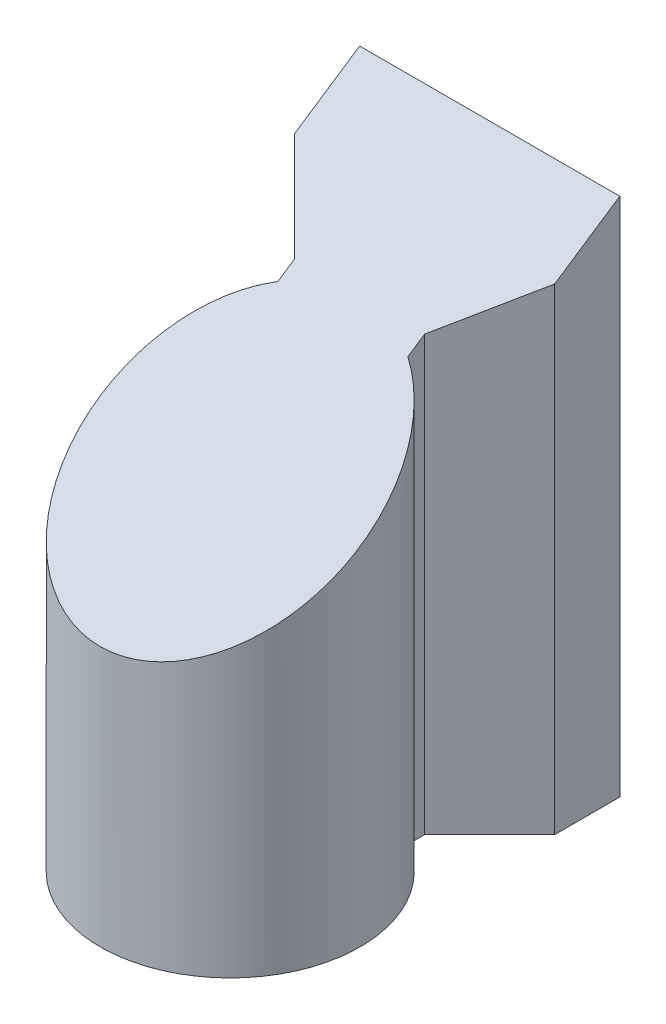
ISO-10303-21;
HEADER;
FILE_DESCRIPTION(('STEP AP214'),'2;1');
FILE_NAME('part.step','',(''),(''),'','','');
FILE_SCHEMA(('AUTOMOTIVE_DESIGN { 1 0 10303 214 1 1 1 1 }'));
ENDSEC;
DATA;
#1=APPLICATION_CONTEXT('core data for automotive mechanical design processes');
#2=APPLICATION_PROTOCOL_DEFINITION('international standard','automotive_design',2000,#1);
#3=PRODUCT_CONTEXT('',#1,'mechanical');
#4=PRODUCT('Part','Part','',(#3));
#5=PRODUCT_RELATED_PRODUCT_CATEGORY('part','',(#4));
#6=PRODUCT_DEFINITION_FORMATION('','',#4);
#7=PRODUCT_DEFINITION_CONTEXT('part definition',#1,'design');
#8=PRODUCT_DEFINITION('design','',#6,#7);
#9=PRODUCT_DEFINITION_SHAPE('','',#8);
#10=(LENGTH_UNIT() NAMED_UNIT(*) SI_UNIT(.MILLI.,.METRE.));
#11=(NAMED_UNIT(*) PLANE_ANGLE_UNIT() SI_UNIT($,.RADIAN.));
#12=(NAMED_UNIT(*) SI_UNIT($,.STERADIAN.) SOLID_ANGLE_UNIT());
#13=UNCERTAINTY_MEASURE_WITH_UNIT(LENGTH_MEASURE(1.E-05),#10,'distance_accuracy_value','');
#14=(GEOMETRIC_REPRESENTATION_CONTEXT(3) GLOBAL_UNCERTAINTY_ASSIGNED_CONTEXT((#13)) GLOBAL_UNIT_ASSIGNED_CONTEXT((#10,
#11,#12)) REPRESENTATION_CONTEXT('',''));
#15=CARTESIAN_POINT('',(0.,0.,0.));
#16=DIRECTION('',(0.,0.,1.));
#17=DIRECTION('',(1.,0.,0.));
#18=AXIS2_PLACEMENT_3D('',#15,#16,#17);
#19=CARTESIAN_POINT('',(0.,40.,0.));
#20=DIRECTION('',(0.,-1.,0.));
#21=DIRECTION('',(0.,0.,-1.));
#22=AXIS2_PLACEMENT_3D('',#19,#20,#21);
#23=CYLINDRICAL_SURFACE('',#22,10.);
#24=CARTESIAN_POINT('',(0.,26.677796327212,0.));
#25=DIRECTION('',(0.,-0.831622862362014,-0.555340809590661));
#26=DIRECTION('',(0.,-0.555340809590661,0.831622862362014));
#27=AXIS2_PLACEMENT_3D('',#24,#25,#26);
#28=ELLIPSE('',#27,12.0246814422556,10.);
#29=CARTESIAN_POINT('',(5.,32.460937587876,-8.66025403784439));
#30=VERTEX_POINT('',#29);
#31=CARTESIAN_POINT('',(-5.,32.460937587876,-8.66025403784438));
#32=VERTEX_POINT('',#31);
#33=EDGE_CURVE('E190',#30,#32,#28,.T.);
#34=ORIENTED_EDGE('',*,*,#33,.T.);
#35=DIRECTION('',(0.,-1.,0.));
#36=VECTOR('',#35,1.);
#37=CARTESIAN_POINT('',(-5.,40.,-8.66025403784438));
#38=LINE('',#37,#36);
#39=CARTESIAN_POINT('',(-5.,0.,-8.66025403784438));
#40=VERTEX_POINT('',#39);
#41=EDGE_CURVE('E98',#32,#40,#38,.T.);
#42=ORIENTED_EDGE('',*,*,#41,.T.);
#43=CARTESIAN_POINT('',(0.,0.,0.));
#44=DIRECTION('',(0.,1.,0.));
#45=DIRECTION('',(0.,0.,1.));
#46=AXIS2_PLACEMENT_3D('',#43,#44,#45);
#47=CIRCLE('',#46,10.);
#48=CARTESIAN_POINT('',(5.,0.,-8.66025403784439));
#49=VERTEX_POINT('',#48);
#50=EDGE_CURVE('E113',#40,#49,#47,.T.);
#51=ORIENTED_EDGE('',*,*,#50,.T.);
#52=DIRECTION('',(0.,-1.,0.));
#53=VECTOR('',#52,1.);
#54=CARTESIAN_POINT('',(5.,40.,-8.66025403784439));
#55=LINE('',#54,#53);
#56=EDGE_CURVE('E11',#30,#49,#55,.T.);
#57=ORIENTED_EDGE('',*,*,#56,.F.);
#58=EDGE_LOOP('',(#34,#42,#51,#57));
#59=FACE_BOUND('',#58,.T.);
#60=ADVANCED_FACE('F39',(#59),#23,.T.);
#61=CARTESIAN_POINT('',(5.,40.,-9.94726706527155));
#62=DIRECTION('',(-1.,0.,0.));
#63=DIRECTION('',(0.,0.,1.));
#64=AXIS2_PLACEMENT_3D('',#61,#62,#63);
#65=PLANE('',#64);
#66=DIRECTION('',(0.,-1.,0.));
#67=VECTOR('',#66,1.);
#68=CARTESIAN_POINT('',(5.,40.,-9.94726706527155));
#69=LINE('',#68,#67);
#70=CARTESIAN_POINT('',(5.,33.3203786746388,-9.94726706527155));
#71=VERTEX_POINT('',#70);
#72=CARTESIAN_POINT('',(5.,0.,-9.94726706527155));
#73=VERTEX_POINT('',#72);
#74=EDGE_CURVE('E48',#71,#73,#69,.T.);
#75=ORIENTED_EDGE('',*,*,#74,.F.);
#76=DIRECTION('',(0.,-0.555340809590661,0.831622862362014));
#77=VECTOR('',#76,1.);
#78=CARTESIAN_POINT('',(5.,35.3803967009298,-13.0321440596423));
#79=LINE('',#78,#77);
#80=EDGE_CURVE('E194',#71,#30,#79,.T.);
#81=ORIENTED_EDGE('',*,*,#80,.T.);
#82=ORIENTED_EDGE('',*,*,#56,.T.);
#83=DIRECTION('',(0.,0.,-1.));
#84=VECTOR('',#83,1.);
#85=CARTESIAN_POINT('',(5.,0.,-9.94726706527155));
#86=LINE('',#85,#84);
#87=EDGE_CURVE('E150',#49,#73,#86,.T.);
#88=ORIENTED_EDGE('',*,*,#87,.T.);
#89=EDGE_LOOP('',(#75,#81,#82,#88));
#90=FACE_BOUND('',#89,.T.);
#91=ADVANCED_FACE('F151',(#90),#65,.F.);
#92=CARTESIAN_POINT('',(5.,40.,-9.94726706527155));
#93=DIRECTION('',(-0.707299949656109,0.,-0.706913559932518));
#94=DIRECTION('',(-0.706913559932518,0.,0.707299949656109));
#95=AXIS2_PLACEMENT_3D('',#92,#93,#94);
#96=PLANE('',#95);
#97=DIRECTION('',(0.,-1.,0.));
#98=VECTOR('',#97,1.);
#99=CARTESIAN_POINT('',(10.,40.,-14.95));
#100=LINE('',#99,#98);
#101=CARTESIAN_POINT('',(10.,36.661101836394,-14.95));
#102=VERTEX_POINT('',#101);
#103=CARTESIAN_POINT('',(10.,0.,-14.95));
#104=VERTEX_POINT('',#103);
#105=EDGE_CURVE('E133',#102,#104,#100,.T.);
#106=ORIENTED_EDGE('',*,*,#105,.F.);
#107=DIRECTION('',(-0.639201371945796,-0.427078965657008,0.639550751071369));
#108=VECTOR('',#107,1.);
#109=CARTESIAN_POINT('',(6.82346622380592,34.5387178443481,-11.7717299719113));
#110=LINE('',#109,#108);
#111=EDGE_CURVE('E147',#102,#71,#110,.T.);
#112=ORIENTED_EDGE('',*,*,#111,.T.);
#113=ORIENTED_EDGE('',*,*,#74,.T.);
#114=DIRECTION('',(0.706913559932518,0.,-0.707299949656109));
#115=VECTOR('',#114,1.);
#116=CARTESIAN_POINT('',(5.,0.,-9.94726706527155));
#117=LINE('',#116,#115);
#118=EDGE_CURVE('E144',#73,#104,#117,.T.);
#119=ORIENTED_EDGE('',*,*,#118,.T.);
#120=EDGE_LOOP('',(#106,#112,#113,#119));
#121=FACE_BOUND('',#120,.T.);
#122=ADVANCED_FACE('F142',(#121),#96,.F.);
#123=CARTESIAN_POINT('',(10.,40.,-19.95));
#124=DIRECTION('',(-1.,0.,0.));
#125=DIRECTION('',(0.,0.,1.));
#126=AXIS2_PLACEMENT_3D('',#123,#124,#125);
#127=PLANE('',#126);
#128=DIRECTION('',(0.,-1.,0.));
#129=VECTOR('',#128,1.);
#130=CARTESIAN_POINT('',(10.,40.,-19.95));
#131=LINE('',#130,#129);
#132=CARTESIAN_POINT('',(10.,40.,-19.95));
#133=VERTEX_POINT('',#132);
#134=CARTESIAN_POINT('',(10.,0.,-19.95));
#135=VERTEX_POINT('',#134);
#136=EDGE_CURVE('E129',#133,#135,#131,.T.);
#137=ORIENTED_EDGE('',*,*,#136,.F.);
#138=DIRECTION('',(0.,-0.555340809590661,0.831622862362014));
#139=VECTOR('',#138,1.);
#140=CARTESIAN_POINT('',(10.,40.,-19.95));
#141=LINE('',#140,#139);
#142=EDGE_CURVE('E55',#133,#102,#141,.T.);
#143=ORIENTED_EDGE('',*,*,#142,.T.);
#144=ORIENTED_EDGE('',*,*,#105,.T.);
#145=DIRECTION('',(0.,0.,-1.));
#146=VECTOR('',#145,1.);
#147=CARTESIAN_POINT('',(10.,0.,-19.95));
#148=LINE('',#147,#146);
#149=EDGE_CURVE('E156',#104,#135,#148,.T.);
#150=ORIENTED_EDGE('',*,*,#149,.T.);
#151=EDGE_LOOP('',(#137,#143,#144,#150));
#152=FACE_BOUND('',#151,.T.);
#153=ADVANCED_FACE('F173',(#152),#127,.F.);
#154=CARTESIAN_POINT('',(0.,40.,-19.95));
#155=DIRECTION('',(0.,0.,1.));
#156=DIRECTION('',(1.,0.,0.));
#157=AXIS2_PLACEMENT_3D('',#154,#155,#156);
#158=PLANE('',#157);
#159=DIRECTION('',(-1.,0.,0.));
#160=VECTOR('',#159,1.);
#161=CARTESIAN_POINT('',(0.,0.,-19.95));
#162=LINE('',#161,#160);
#163=CARTESIAN_POINT('',(-10.,0.,-19.95));
#164=VERTEX_POINT('',#163);
#165=EDGE_CURVE('E160',#135,#164,#162,.T.);
#166=ORIENTED_EDGE('',*,*,#165,.T.);
#167=DIRECTION('',(0.,-1.,0.));
#168=VECTOR('',#167,1.);
#169=CARTESIAN_POINT('',(-10.,40.,-19.95));
#170=LINE('',#169,#168);
#171=CARTESIAN_POINT('',(-10.,40.,-19.95));
#172=VERTEX_POINT('',#171);
#173=EDGE_CURVE('E125',#172,#164,#170,.T.);
#174=ORIENTED_EDGE('',*,*,#173,.F.);
#175=DIRECTION('',(-1.,0.,0.));
#176=VECTOR('',#175,1.);
#177=CARTESIAN_POINT('',(0.,40.,-19.95));
#178=LINE('',#177,#176);
#179=EDGE_CURVE('E115',#133,#172,#178,.T.);
#180=ORIENTED_EDGE('',*,*,#179,.F.);
#181=ORIENTED_EDGE('',*,*,#136,.T.);
#182=EDGE_LOOP('',(#166,#174,#180,#181));
#183=FACE_BOUND('',#182,.T.);
#184=ADVANCED_FACE('F175',(#183),#158,.F.);
#185=CARTESIAN_POINT('',(-10.,40.,-19.95));
#186=DIRECTION('',(1.,0.,0.));
#187=DIRECTION('',(0.,0.,-1.));
#188=AXIS2_PLACEMENT_3D('',#185,#186,#187);
#189=PLANE('',#188);
#190=DIRECTION('',(0.,-1.,0.));
#191=VECTOR('',#190,1.);
#192=CARTESIAN_POINT('',(-10.,40.,-14.95));
#193=LINE('',#192,#191);
#194=CARTESIAN_POINT('',(-10.,36.661101836394,-14.95));
#195=VERTEX_POINT('',#194);
#196=CARTESIAN_POINT('',(-10.,0.,-14.95));
#197=VERTEX_POINT('',#196);
#198=EDGE_CURVE('E97',#195,#197,#193,.T.);
#199=ORIENTED_EDGE('',*,*,#198,.F.);
#200=DIRECTION('',(0.,-0.555340809590661,0.831622862362014));
#201=VECTOR('',#200,1.);
#202=CARTESIAN_POINT('',(-10.,20.,9.99999999999999));
#203=LINE('',#202,#201);
#204=EDGE_CURVE('E180',#172,#195,#203,.T.);
#205=ORIENTED_EDGE('',*,*,#204,.F.);
#206=ORIENTED_EDGE('',*,*,#173,.T.);
#207=DIRECTION('',(0.,0.,1.));
#208=VECTOR('',#207,1.);
#209=CARTESIAN_POINT('',(-10.,0.,-19.95));
#210=LINE('',#209,#208);
#211=EDGE_CURVE('E108',#164,#197,#210,.T.);
#212=ORIENTED_EDGE('',*,*,#211,.T.);
#213=EDGE_LOOP('',(#199,#205,#206,#212));
#214=FACE_BOUND('',#213,.T.);
#215=ADVANCED_FACE('F167',(#214),#189,.F.);
#216=CARTESIAN_POINT('',(-5.,40.,-9.94726706527155));
#217=DIRECTION('',(0.707299949656108,0.,-0.706913559932519));
#218=DIRECTION('',(-0.706913559932519,0.,-0.707299949656108));
#219=AXIS2_PLACEMENT_3D('',#216,#217,#218);
#220=PLANE('',#219);
#221=DIRECTION('',(0.,-1.,0.));
#222=VECTOR('',#221,1.);
#223=CARTESIAN_POINT('',(-5.,40.,-9.94726706527155));
#224=LINE('',#223,#222);
#225=CARTESIAN_POINT('',(-5.,33.3203786746388,-9.94726706527155));
#226=VERTEX_POINT('',#225);
#227=CARTESIAN_POINT('',(-5.,0.,-9.94726706527155));
#228=VERTEX_POINT('',#227);
#229=EDGE_CURVE('E84',#226,#228,#224,.T.);
#230=ORIENTED_EDGE('',*,*,#229,.F.);
#231=DIRECTION('',(-0.639201371945797,0.427078965657008,-0.639550751071369));
#232=VECTOR('',#231,1.);
#233=CARTESIAN_POINT('',(-6.82346622380592,34.5387178443481,-11.7717299719113));
#234=LINE('',#233,#232);
#235=EDGE_CURVE('E185',#226,#195,#234,.T.);
#236=ORIENTED_EDGE('',*,*,#235,.T.);
#237=ORIENTED_EDGE('',*,*,#198,.T.);
#238=DIRECTION('',(0.706913559932519,0.,0.707299949656108));
#239=VECTOR('',#238,1.);
#240=CARTESIAN_POINT('',(-5.,0.,-9.94726706527155));
#241=LINE('',#240,#239);
#242=EDGE_CURVE('E101',#197,#228,#241,.T.);
#243=ORIENTED_EDGE('',*,*,#242,.T.);
#244=EDGE_LOOP('',(#230,#236,#237,#243));
#245=FACE_BOUND('',#244,.T.);
#246=ADVANCED_FACE('F102',(#245),#220,.F.);
#247=CARTESIAN_POINT('',(-5.,40.,-9.94726706527155));
#248=DIRECTION('',(1.,0.,0.));
#249=DIRECTION('',(0.,0.,-1.));
#250=AXIS2_PLACEMENT_3D('',#247,#248,#249);
#251=PLANE('',#250);
#252=ORIENTED_EDGE('',*,*,#41,.F.);
#253=DIRECTION('',(0.,0.555340809590661,-0.831622862362014));
#254=VECTOR('',#253,1.);
#255=CARTESIAN_POINT('',(-5.,35.3803967009298,-13.0321440596423));
#256=LINE('',#255,#254);
#257=EDGE_CURVE('E93',#32,#226,#256,.T.);
#258=ORIENTED_EDGE('',*,*,#257,.T.);
#259=ORIENTED_EDGE('',*,*,#229,.T.);
#260=DIRECTION('',(0.,0.,1.));
#261=VECTOR('',#260,1.);
#262=CARTESIAN_POINT('',(-5.,0.,-9.94726706527155));
#263=LINE('',#262,#261);
#264=EDGE_CURVE('E89',#228,#40,#263,.T.);
#265=ORIENTED_EDGE('',*,*,#264,.T.);
#266=EDGE_LOOP('',(#252,#258,#259,#265));
#267=FACE_BOUND('',#266,.T.);
#268=ADVANCED_FACE('F87',(#267),#251,.F.);
#269=CARTESIAN_POINT('',(0.,0.,0.));
#270=DIRECTION('',(0.,1.,0.));
#271=DIRECTION('',(0.,0.,1.));
#272=AXIS2_PLACEMENT_3D('',#269,#270,#271);
#273=PLANE('',#272);
#274=ORIENTED_EDGE('',*,*,#50,.F.);
#275=ORIENTED_EDGE('',*,*,#264,.F.);
#276=ORIENTED_EDGE('',*,*,#242,.F.);
#277=ORIENTED_EDGE('',*,*,#211,.F.);
#278=ORIENTED_EDGE('',*,*,#165,.F.);
#279=ORIENTED_EDGE('',*,*,#149,.F.);
#280=ORIENTED_EDGE('',*,*,#118,.F.);
#281=ORIENTED_EDGE('',*,*,#87,.F.);
#282=EDGE_LOOP('',(#274,#275,#276,#277,#278,#279,#280,#281));
#283=FACE_BOUND('',#282,.T.);
#284=ADVANCED_FACE('F110',(#283),#273,.F.);
#285=CARTESIAN_POINT('',(30.,20.,10.));
#286=DIRECTION('',(0.,-0.831622862362014,-0.555340809590661));
#287=DIRECTION('',(0.,0.555340809590661,-0.831622862362014));
#288=AXIS2_PLACEMENT_3D('',#285,#286,#287);
#289=PLANE('',#288);
#290=ORIENTED_EDGE('',*,*,#179,.T.);
#291=ORIENTED_EDGE('',*,*,#204,.T.);
#292=ORIENTED_EDGE('',*,*,#235,.F.);
#293=ORIENTED_EDGE('',*,*,#257,.F.);
#294=ORIENTED_EDGE('',*,*,#33,.F.);
#295=ORIENTED_EDGE('',*,*,#80,.F.);
#296=ORIENTED_EDGE('',*,*,#111,.F.);
#297=ORIENTED_EDGE('',*,*,#142,.F.);
#298=EDGE_LOOP('',(#290,#291,#292,#293,#294,#295,#296,#297));
#299=FACE_BOUND('',#298,.T.);
#300=ADVANCED_FACE('F178',(#299),#289,.F.);
#301=CLOSED_SHELL('',(#60,#91,#122,#153,#184,#215,#246,#268,#284,#300));
#302=MANIFOLD_SOLID_BREP('B2',#301);
#303=ADVANCED_BREP_SHAPE_REPRESENTATION('',(#18,#302),#14);
#304=SHAPE_DEFINITION_REPRESENTATION(#9,#303);
ENDSEC;
END-ISO-10303-21;
